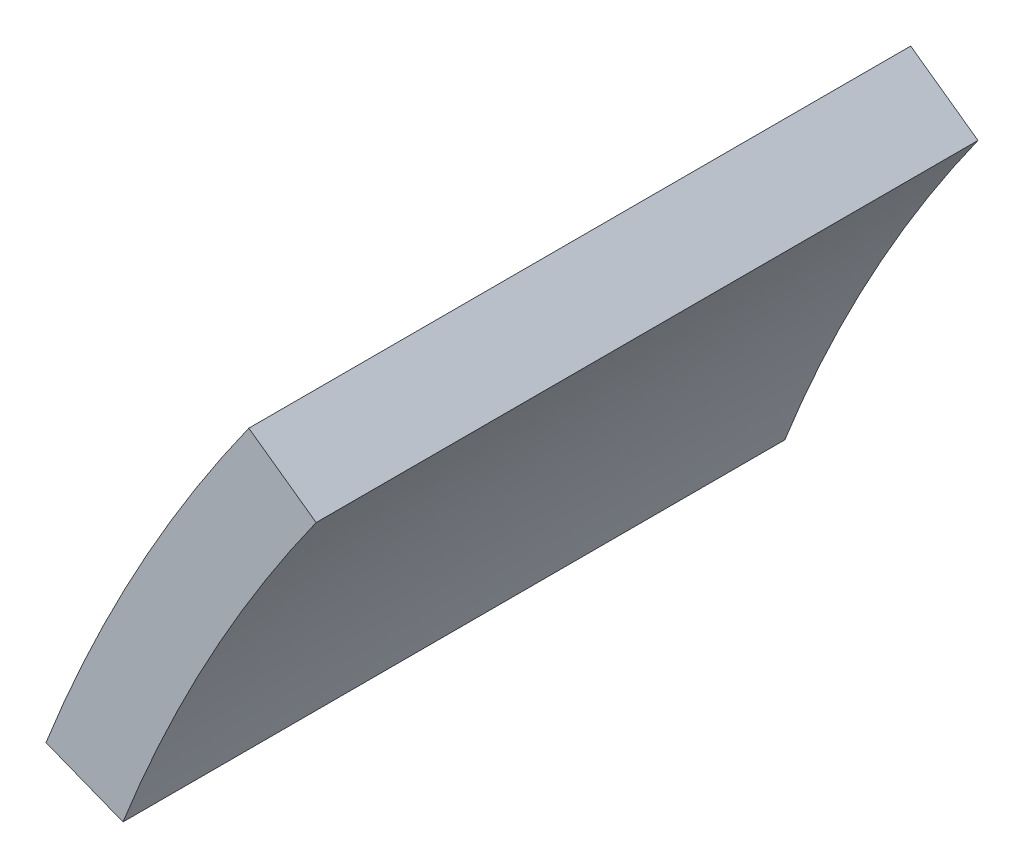
ISO-10303-21;
HEADER;
FILE_DESCRIPTION(('STEP AP214'),'2;1');
FILE_NAME('part.step','',(''),(''),'','','');
FILE_SCHEMA(('AUTOMOTIVE_DESIGN { 1 0 10303 214 1 1 1 1 }'));
ENDSEC;
DATA;
#1=APPLICATION_CONTEXT('core data for automotive mechanical design processes');
#2=APPLICATION_PROTOCOL_DEFINITION('international standard','automotive_design',2000,#1);
#3=PRODUCT_CONTEXT('',#1,'mechanical');
#4=PRODUCT('Part','Part','',(#3));
#5=PRODUCT_RELATED_PRODUCT_CATEGORY('part','',(#4));
#6=PRODUCT_DEFINITION_FORMATION('','',#4);
#7=PRODUCT_DEFINITION_CONTEXT('part definition',#1,'design');
#8=PRODUCT_DEFINITION('design','',#6,#7);
#9=PRODUCT_DEFINITION_SHAPE('','',#8);
#10=(LENGTH_UNIT() NAMED_UNIT(*) SI_UNIT(.MILLI.,.METRE.));
#11=(NAMED_UNIT(*) PLANE_ANGLE_UNIT() SI_UNIT($,.RADIAN.));
#12=(NAMED_UNIT(*) SI_UNIT($,.STERADIAN.) SOLID_ANGLE_UNIT());
#13=UNCERTAINTY_MEASURE_WITH_UNIT(LENGTH_MEASURE(1.E-05),#10,'distance_accuracy_value','');
#14=(GEOMETRIC_REPRESENTATION_CONTEXT(3) GLOBAL_UNCERTAINTY_ASSIGNED_CONTEXT((#13)) GLOBAL_UNIT_ASSIGNED_CONTEXT((#10,
#11,#12)) REPRESENTATION_CONTEXT('',''));
#15=CARTESIAN_POINT('',(0.,0.,0.));
#16=DIRECTION('',(0.,0.,1.));
#17=DIRECTION('',(1.,0.,0.));
#18=AXIS2_PLACEMENT_3D('',#15,#16,#17);
#19=CARTESIAN_POINT('',(-43.4326760913678,-4.99797473596938,10.));
#20=DIRECTION('',(0.365552226821595,0.930790830136274,0.));
#21=DIRECTION('',(0.,0.,-1.));
#22=AXIS2_PLACEMENT_3D('',#19,#20,#21);
#23=PLANE('',#22);
#24=DIRECTION('',(0.930790830136274,-0.365552226821595,0.));
#25=VECTOR('',#24,1.);
#26=CARTESIAN_POINT('',(-43.4326760913678,-4.99797473596937,-18.));
#27=LINE('',#26,#25);
#28=CARTESIAN_POINT('',(-154.71514804373,38.7063185502481,-18.));
#29=VERTEX_POINT('',#28);
#30=CARTESIAN_POINT('',(-150.759287015622,37.1527215862453,-18.));
#31=VERTEX_POINT('',#30);
#32=EDGE_CURVE('E11',#29,#31,#27,.T.);
#33=ORIENTED_EDGE('',*,*,#32,.T.);
#34=DIRECTION('',(0.,0.,-1.));
#35=VECTOR('',#34,1.);
#36=CARTESIAN_POINT('',(-150.759287015622,37.1527215862453,10.));
#37=LINE('',#36,#35);
#38=CARTESIAN_POINT('',(-150.759287015622,37.1527215862453,16.));
#39=VERTEX_POINT('',#38);
#40=EDGE_CURVE('E21',#39,#31,#37,.T.);
#41=ORIENTED_EDGE('',*,*,#40,.F.);
#42=DIRECTION('',(0.930790830136274,-0.365552226821595,0.));
#43=VECTOR('',#42,1.);
#44=CARTESIAN_POINT('',(-43.4326760913678,-4.99797473596937,16.));
#45=LINE('',#44,#43);
#46=CARTESIAN_POINT('',(-154.71514804373,38.7063185502481,16.));
#47=VERTEX_POINT('',#46);
#48=EDGE_CURVE('E56',#47,#39,#45,.T.);
#49=ORIENTED_EDGE('',*,*,#48,.F.);
#50=DIRECTION('',(0.,0.,-1.));
#51=VECTOR('',#50,1.);
#52=CARTESIAN_POINT('',(-154.71514804373,38.7063185502481,10.));
#53=LINE('',#52,#51);
#54=EDGE_CURVE('E28',#47,#29,#53,.T.);
#55=ORIENTED_EDGE('',*,*,#54,.T.);
#56=EDGE_LOOP('',(#33,#41,#49,#55));
#57=FACE_BOUND('',#56,.T.);
#58=ADVANCED_FACE('F17',(#57),#23,.F.);
#59=CARTESIAN_POINT('',(-71.8747641621128,6.17217036174182,10.));
#60=DIRECTION('',(0.,0.,-1.));
#61=DIRECTION('',(-1.,0.,0.));
#62=AXIS2_PLACEMENT_3D('',#59,#60,#61);
#63=CYLINDRICAL_SURFACE('',#62,89.00000000003);
#64=CARTESIAN_POINT('',(-71.8747641621128,6.17217036174182,-18.));
#65=DIRECTION('',(0.,0.,1.));
#66=DIRECTION('',(-1.,0.,0.));
#67=AXIS2_PLACEMENT_3D('',#64,#65,#66);
#68=CIRCLE('',#67,89.00000000003);
#69=CARTESIAN_POINT('',(-144.29577845993,57.9041400524538,-18.));
#70=VERTEX_POINT('',#69);
#71=EDGE_CURVE('E68',#70,#29,#68,.T.);
#72=ORIENTED_EDGE('',*,*,#71,.T.);
#73=ORIENTED_EDGE('',*,*,#54,.F.);
#74=CARTESIAN_POINT('',(-71.8747641621128,6.17217036174182,16.));
#75=DIRECTION('',(0.,0.,1.));
#76=DIRECTION('',(-1.,0.,0.));
#77=AXIS2_PLACEMENT_3D('',#74,#75,#76);
#78=CIRCLE('',#77,89.00000000003);
#79=CARTESIAN_POINT('',(-144.29577845993,57.9041400524538,16.));
#80=VERTEX_POINT('',#79);
#81=EDGE_CURVE('E61',#80,#47,#78,.T.);
#82=ORIENTED_EDGE('',*,*,#81,.F.);
#83=DIRECTION('',(0.,0.,-1.));
#84=VECTOR('',#83,1.);
#85=CARTESIAN_POINT('',(-144.29577845993,57.9041400524538,10.));
#86=LINE('',#85,#84);
#87=EDGE_CURVE('E89',#80,#70,#86,.T.);
#88=ORIENTED_EDGE('',*,*,#87,.T.);
#89=EDGE_LOOP('',(#72,#73,#82,#88));
#90=FACE_BOUND('',#89,.T.);
#91=ADVANCED_FACE('F65',(#90),#63,.T.);
#92=CARTESIAN_POINT('',(-43.2038767027316,-14.3080934897024,10.));
#93=DIRECTION('',(-0.581258086423631,-0.813719261764854,0.));
#94=DIRECTION('',(-0.813719261764854,0.581258086423631,0.));
#95=AXIS2_PLACEMENT_3D('',#92,#93,#94);
#96=PLANE('',#95);
#97=DIRECTION('',(-0.813719261764854,0.581258086423631,0.));
#98=VECTOR('',#97,1.);
#99=CARTESIAN_POINT('',(-43.2038767027316,-14.3080934897024,-18.));
#100=LINE('',#99,#98);
#101=CARTESIAN_POINT('',(-140.837471597404,55.4337931851359,-18.));
#102=VERTEX_POINT('',#101);
#103=EDGE_CURVE('E86',#102,#70,#100,.T.);
#104=ORIENTED_EDGE('',*,*,#103,.T.);
#105=ORIENTED_EDGE('',*,*,#87,.F.);
#106=DIRECTION('',(-0.813719261764854,0.581258086423631,0.));
#107=VECTOR('',#106,1.);
#108=CARTESIAN_POINT('',(-43.2038767027316,-14.3080934897024,16.));
#109=LINE('',#108,#107);
#110=CARTESIAN_POINT('',(-140.837471597404,55.4337931851359,16.));
#111=VERTEX_POINT('',#110);
#112=EDGE_CURVE('E73',#111,#80,#109,.T.);
#113=ORIENTED_EDGE('',*,*,#112,.F.);
#114=DIRECTION('',(0.,0.,-1.));
#115=VECTOR('',#114,1.);
#116=CARTESIAN_POINT('',(-140.837471597404,55.4337931851359,10.));
#117=LINE('',#116,#115);
#118=EDGE_CURVE('E90',#111,#102,#117,.T.);
#119=ORIENTED_EDGE('',*,*,#118,.T.);
#120=EDGE_LOOP('',(#104,#105,#113,#119));
#121=FACE_BOUND('',#120,.T.);
#122=ADVANCED_FACE('F19',(#121),#96,.F.);
#123=CARTESIAN_POINT('',(-71.8747641621128,6.17217036174182,10.));
#124=DIRECTION('',(0.,0.,-1.));
#125=DIRECTION('',(-1.,0.,0.));
#126=AXIS2_PLACEMENT_3D('',#123,#124,#125);
#127=CYLINDRICAL_SURFACE('',#126,84.7499999999998);
#128=CARTESIAN_POINT('',(-71.8747641621128,6.17217036174182,-18.));
#129=DIRECTION('',(0.,0.,1.));
#130=DIRECTION('',(-1.,0.,0.));
#131=AXIS2_PLACEMENT_3D('',#128,#129,#130);
#132=CIRCLE('',#131,84.7499999999998);
#133=EDGE_CURVE('E80',#102,#31,#132,.T.);
#134=ORIENTED_EDGE('',*,*,#133,.F.);
#135=ORIENTED_EDGE('',*,*,#118,.F.);
#136=CARTESIAN_POINT('',(-71.8747641621128,6.17217036174182,16.));
#137=DIRECTION('',(0.,0.,1.));
#138=DIRECTION('',(-1.,0.,0.));
#139=AXIS2_PLACEMENT_3D('',#136,#137,#138);
#140=CIRCLE('',#139,84.7499999999998);
#141=EDGE_CURVE('E93',#111,#39,#140,.T.);
#142=ORIENTED_EDGE('',*,*,#141,.T.);
#143=ORIENTED_EDGE('',*,*,#40,.T.);
#144=EDGE_LOOP('',(#134,#135,#142,#143));
#145=FACE_BOUND('',#144,.T.);
#146=ADVANCED_FACE('F107',(#145),#127,.F.);
#147=CARTESIAN_POINT('',(-51.833752333337,-26.38929492376,-18.));
#148=DIRECTION('',(0.,0.,1.));
#149=DIRECTION('',(1.,0.,0.));
#150=AXIS2_PLACEMENT_3D('',#147,#148,#149);
#151=PLANE('',#150);
#152=ORIENTED_EDGE('',*,*,#133,.T.);
#153=ORIENTED_EDGE('',*,*,#32,.F.);
#154=ORIENTED_EDGE('',*,*,#71,.F.);
#155=ORIENTED_EDGE('',*,*,#103,.F.);
#156=EDGE_LOOP('',(#152,#153,#154,#155));
#157=FACE_BOUND('',#156,.T.);
#158=ADVANCED_FACE('F105',(#157),#151,.F.);
#159=CARTESIAN_POINT('',(-51.833752333337,-26.38929492376,16.));
#160=DIRECTION('',(0.,0.,1.));
#161=DIRECTION('',(1.,0.,0.));
#162=AXIS2_PLACEMENT_3D('',#159,#160,#161);
#163=PLANE('',#162);
#164=ORIENTED_EDGE('',*,*,#141,.F.);
#165=ORIENTED_EDGE('',*,*,#112,.T.);
#166=ORIENTED_EDGE('',*,*,#81,.T.);
#167=ORIENTED_EDGE('',*,*,#48,.T.);
#168=EDGE_LOOP('',(#164,#165,#166,#167));
#169=FACE_BOUND('',#168,.T.);
#170=ADVANCED_FACE('F72',(#169),#163,.T.);
#171=CLOSED_SHELL('',(#58,#91,#122,#146,#158,#170));
#172=MANIFOLD_SOLID_BREP('B1',#171);
#173=ADVANCED_BREP_SHAPE_REPRESENTATION('',(#18,#172),#14);
#174=SHAPE_DEFINITION_REPRESENTATION(#9,#173);
ENDSEC;
END-ISO-10303-21;
